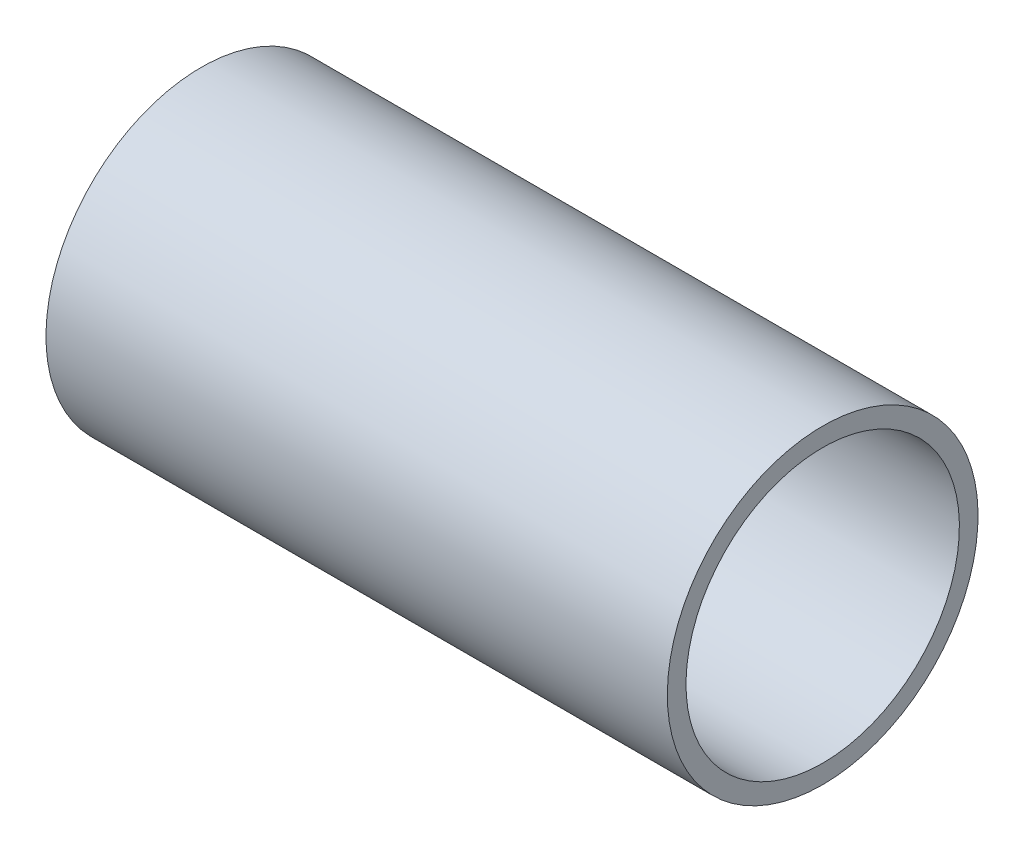
ISO-10303-21;
HEADER;
FILE_DESCRIPTION(('STEP AP214'),'2;1');
FILE_NAME('part.step','',(''),(''),'','','');
FILE_SCHEMA(('AUTOMOTIVE_DESIGN { 1 0 10303 214 1 1 1 1 }'));
ENDSEC;
DATA;
#1=APPLICATION_CONTEXT('core data for automotive mechanical design processes');
#2=APPLICATION_PROTOCOL_DEFINITION('international standard','automotive_design',2000,#1);
#3=PRODUCT_CONTEXT('',#1,'mechanical');
#4=PRODUCT('Part','Part','',(#3));
#5=PRODUCT_RELATED_PRODUCT_CATEGORY('part','',(#4));
#6=PRODUCT_DEFINITION_FORMATION('','',#4);
#7=PRODUCT_DEFINITION_CONTEXT('part definition',#1,'design');
#8=PRODUCT_DEFINITION('design','',#6,#7);
#9=PRODUCT_DEFINITION_SHAPE('','',#8);
#10=(LENGTH_UNIT() NAMED_UNIT(*) SI_UNIT(.MILLI.,.METRE.));
#11=(NAMED_UNIT(*) PLANE_ANGLE_UNIT() SI_UNIT($,.RADIAN.));
#12=(NAMED_UNIT(*) SI_UNIT($,.STERADIAN.) SOLID_ANGLE_UNIT());
#13=UNCERTAINTY_MEASURE_WITH_UNIT(LENGTH_MEASURE(1.E-05),#10,'distance_accuracy_value','');
#14=(GEOMETRIC_REPRESENTATION_CONTEXT(3) GLOBAL_UNCERTAINTY_ASSIGNED_CONTEXT((#13)) GLOBAL_UNIT_ASSIGNED_CONTEXT((#10,
#11,#12)) REPRESENTATION_CONTEXT('',''));
#15=CARTESIAN_POINT('',(0.,0.,0.));
#16=DIRECTION('',(0.,0.,1.));
#17=DIRECTION('',(1.,0.,0.));
#18=AXIS2_PLACEMENT_3D('',#15,#16,#17);
#19=CARTESIAN_POINT('',(0.,25.,0.));
#20=DIRECTION('',(1.,0.,0.));
#21=DIRECTION('',(0.,1.,0.));
#22=AXIS2_PLACEMENT_3D('',#19,#20,#21);
#23=PLANE('',#22);
#24=CARTESIAN_POINT('',(0.,0.,0.));
#25=DIRECTION('',(-1.,0.,0.));
#26=DIRECTION('',(0.,-1.,0.));
#27=AXIS2_PLACEMENT_3D('',#24,#25,#26);
#28=CIRCLE('',#27,22.);
#29=CARTESIAN_POINT('',(0.,-22.,0.));
#30=VERTEX_POINT('',#29);
#31=EDGE_CURVE('E10',#30,#30,#28,.T.);
#32=ORIENTED_EDGE('',*,*,#31,.F.);
#33=EDGE_LOOP('',(#32));
#34=FACE_BOUND('',#33,.T.);
#35=CARTESIAN_POINT('',(0.,0.,0.));
#36=DIRECTION('',(-1.,0.,0.));
#37=DIRECTION('',(0.,-1.,0.));
#38=AXIS2_PLACEMENT_3D('',#35,#36,#37);
#39=CIRCLE('',#38,25.);
#40=CARTESIAN_POINT('',(0.,-25.,0.));
#41=VERTEX_POINT('',#40);
#42=EDGE_CURVE('E45',#41,#41,#39,.T.);
#43=ORIENTED_EDGE('',*,*,#42,.T.);
#44=EDGE_LOOP('',(#43));
#45=FACE_BOUND('',#44,.T.);
#46=ADVANCED_FACE('F31',(#34,#45),#23,.F.);
#47=CARTESIAN_POINT('',(0.,0.,0.));
#48=DIRECTION('',(-1.,0.,0.));
#49=DIRECTION('',(0.,-1.,0.));
#50=AXIS2_PLACEMENT_3D('',#47,#48,#49);
#51=CYLINDRICAL_SURFACE('',#50,22.);
#52=CARTESIAN_POINT('',(100.,0.,0.));
#53=DIRECTION('',(-1.,0.,0.));
#54=DIRECTION('',(0.,-1.,0.));
#55=AXIS2_PLACEMENT_3D('',#52,#53,#54);
#56=CIRCLE('',#55,22.);
#57=CARTESIAN_POINT('',(100.,-22.,0.));
#58=VERTEX_POINT('',#57);
#59=EDGE_CURVE('E37',#58,#58,#56,.T.);
#60=ORIENTED_EDGE('',*,*,#59,.F.);
#61=EDGE_LOOP('',(#60));
#62=FACE_BOUND('',#61,.T.);
#63=ORIENTED_EDGE('',*,*,#31,.T.);
#64=EDGE_LOOP('',(#63));
#65=FACE_BOUND('',#64,.T.);
#66=ADVANCED_FACE('F60',(#62,#65),#51,.F.);
#67=CARTESIAN_POINT('',(100.,25.,0.));
#68=DIRECTION('',(-1.,0.,0.));
#69=DIRECTION('',(0.,-1.,0.));
#70=AXIS2_PLACEMENT_3D('',#67,#68,#69);
#71=PLANE('',#70);
#72=CARTESIAN_POINT('',(100.,0.,0.));
#73=DIRECTION('',(-1.,0.,0.));
#74=DIRECTION('',(0.,-1.,0.));
#75=AXIS2_PLACEMENT_3D('',#72,#73,#74);
#76=CIRCLE('',#75,25.);
#77=CARTESIAN_POINT('',(100.,-25.,0.));
#78=VERTEX_POINT('',#77);
#79=EDGE_CURVE('E41',#78,#78,#76,.T.);
#80=ORIENTED_EDGE('',*,*,#79,.F.);
#81=EDGE_LOOP('',(#80));
#82=FACE_BOUND('',#81,.T.);
#83=ORIENTED_EDGE('',*,*,#59,.T.);
#84=EDGE_LOOP('',(#83));
#85=FACE_BOUND('',#84,.T.);
#86=ADVANCED_FACE('F55',(#82,#85),#71,.F.);
#87=CARTESIAN_POINT('',(0.,0.,0.));
#88=DIRECTION('',(-1.,0.,0.));
#89=DIRECTION('',(0.,-1.,0.));
#90=AXIS2_PLACEMENT_3D('',#87,#88,#89);
#91=CYLINDRICAL_SURFACE('',#90,25.);
#92=ORIENTED_EDGE('',*,*,#42,.F.);
#93=EDGE_LOOP('',(#92));
#94=FACE_BOUND('',#93,.T.);
#95=ORIENTED_EDGE('',*,*,#79,.T.);
#96=EDGE_LOOP('',(#95));
#97=FACE_BOUND('',#96,.T.);
#98=ADVANCED_FACE('F52',(#94,#97),#91,.T.);
#99=CLOSED_SHELL('',(#46,#66,#86,#98));
#100=MANIFOLD_SOLID_BREP('B2',#99);
#101=ADVANCED_BREP_SHAPE_REPRESENTATION('',(#18,#100),#14);
#102=SHAPE_DEFINITION_REPRESENTATION(#9,#101);
ENDSEC;
END-ISO-10303-21;
